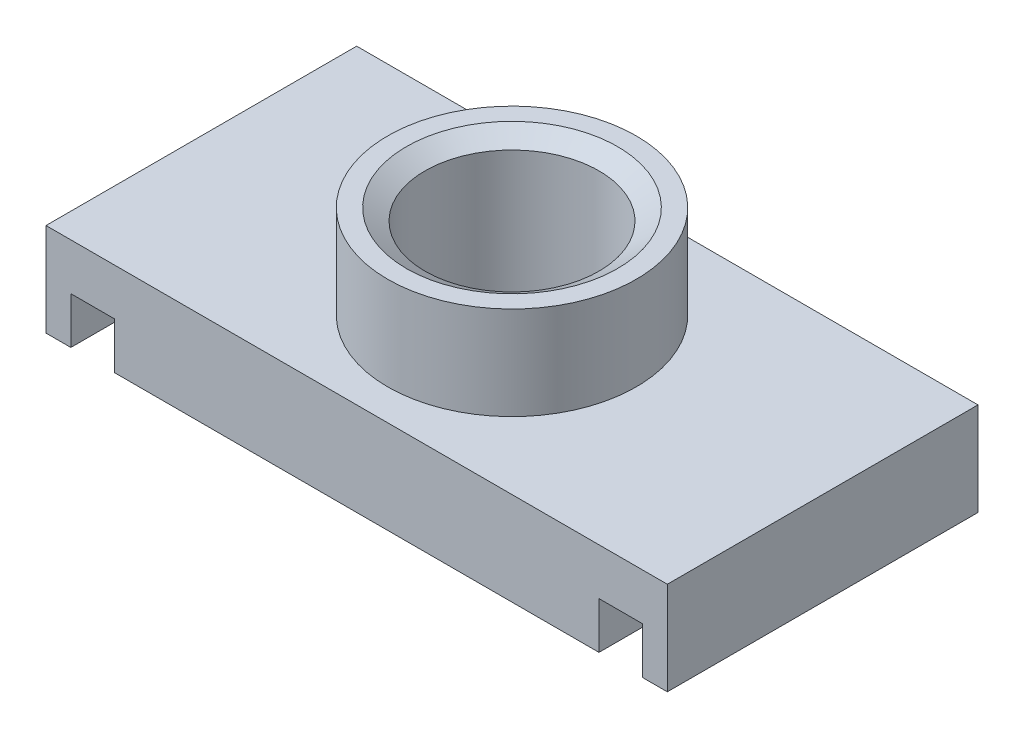
ISO-10303-21;
HEADER;
FILE_DESCRIPTION(('STEP AP214'),'2;1');
FILE_NAME('part.step','',(''),(''),'','','');
FILE_SCHEMA(('AUTOMOTIVE_DESIGN { 1 0 10303 214 1 1 1 1 }'));
ENDSEC;
DATA;
#1=APPLICATION_CONTEXT('core data for automotive mechanical design processes');
#2=APPLICATION_PROTOCOL_DEFINITION('international standard','automotive_design',2000,#1);
#3=PRODUCT_CONTEXT('',#1,'mechanical');
#4=PRODUCT('Part','Part','',(#3));
#5=PRODUCT_RELATED_PRODUCT_CATEGORY('part','',(#4));
#6=PRODUCT_DEFINITION_FORMATION('','',#4);
#7=PRODUCT_DEFINITION_CONTEXT('part definition',#1,'design');
#8=PRODUCT_DEFINITION('design','',#6,#7);
#9=PRODUCT_DEFINITION_SHAPE('','',#8);
#10=(LENGTH_UNIT() NAMED_UNIT(*) SI_UNIT(.MILLI.,.METRE.));
#11=(NAMED_UNIT(*) PLANE_ANGLE_UNIT() SI_UNIT($,.RADIAN.));
#12=(NAMED_UNIT(*) SI_UNIT($,.STERADIAN.) SOLID_ANGLE_UNIT());
#13=UNCERTAINTY_MEASURE_WITH_UNIT(LENGTH_MEASURE(1.E-05),#10,'distance_accuracy_value','');
#14=(GEOMETRIC_REPRESENTATION_CONTEXT(3) GLOBAL_UNCERTAINTY_ASSIGNED_CONTEXT((#13)) GLOBAL_UNIT_ASSIGNED_CONTEXT((#10,
#11,#12)) REPRESENTATION_CONTEXT('',''));
#15=CARTESIAN_POINT('',(0.,0.,0.));
#16=DIRECTION('',(0.,0.,1.));
#17=DIRECTION('',(1.,0.,0.));
#18=AXIS2_PLACEMENT_3D('',#15,#16,#17);
#19=CARTESIAN_POINT('',(0.,0.,0.));
#20=DIRECTION('',(0.,1.,0.));
#21=DIRECTION('',(0.,0.,1.));
#22=AXIS2_PLACEMENT_3D('',#19,#20,#21);
#23=PLANE('',#22);
#24=DIRECTION('',(-1.,0.,0.));
#25=VECTOR('',#24,1.);
#26=CARTESIAN_POINT('',(-50.,0.,-25.));
#27=LINE('',#26,#25);
#28=CARTESIAN_POINT('',(-46.,0.,-25.));
#29=VERTEX_POINT('',#28);
#30=CARTESIAN_POINT('',(-50.,0.,-25.));
#31=VERTEX_POINT('',#30);
#32=EDGE_CURVE('E220',#29,#31,#27,.T.);
#33=ORIENTED_EDGE('',*,*,#32,.F.);
#34=DIRECTION('',(0.,0.,1.));
#35=VECTOR('',#34,1.);
#36=CARTESIAN_POINT('',(-46.,0.,0.));
#37=LINE('',#36,#35);
#38=CARTESIAN_POINT('',(-46.,0.,25.));
#39=VERTEX_POINT('',#38);
#40=EDGE_CURVE('E197',#29,#39,#37,.T.);
#41=ORIENTED_EDGE('',*,*,#40,.T.);
#42=DIRECTION('',(1.,0.,0.));
#43=VECTOR('',#42,1.);
#44=CARTESIAN_POINT('',(-50.,0.,25.));
#45=LINE('',#44,#43);
#46=CARTESIAN_POINT('',(-50.,0.,25.));
#47=VERTEX_POINT('',#46);
#48=EDGE_CURVE('E207',#47,#39,#45,.T.);
#49=ORIENTED_EDGE('',*,*,#48,.F.);
#50=DIRECTION('',(0.,0.,1.));
#51=VECTOR('',#50,1.);
#52=CARTESIAN_POINT('',(-50.,0.,-25.));
#53=LINE('',#52,#51);
#54=EDGE_CURVE('E225',#31,#47,#53,.T.);
#55=ORIENTED_EDGE('',*,*,#54,.F.);
#56=EDGE_LOOP('',(#33,#41,#49,#55));
#57=FACE_BOUND('',#56,.T.);
#58=ADVANCED_FACE('F39',(#57),#23,.F.);
#59=CARTESIAN_POINT('',(0.,0.,0.));
#60=DIRECTION('',(0.,1.,0.));
#61=DIRECTION('',(0.,0.,1.));
#62=AXIS2_PLACEMENT_3D('',#59,#60,#61);
#63=CIRCLE('',#62,14.);
#64=CARTESIAN_POINT('',(0.,0.,14.));
#65=VERTEX_POINT('',#64);
#66=EDGE_CURVE('E257',#65,#65,#63,.T.);
#67=ORIENTED_EDGE('',*,*,#66,.T.);
#68=EDGE_LOOP('',(#67));
#69=FACE_BOUND('',#68,.T.);
#70=CARTESIAN_POINT('',(-39.,0.,25.));
#71=VERTEX_POINT('',#70);
#72=CARTESIAN_POINT('',(39.,0.,25.));
#73=VERTEX_POINT('',#72);
#74=EDGE_CURVE('E232',#71,#73,#45,.T.);
#75=ORIENTED_EDGE('',*,*,#74,.F.);
#76=DIRECTION('',(0.,0.,-1.));
#77=VECTOR('',#76,1.);
#78=CARTESIAN_POINT('',(-39.,0.,0.));
#79=LINE('',#78,#77);
#80=CARTESIAN_POINT('',(-39.,0.,-25.));
#81=VERTEX_POINT('',#80);
#82=EDGE_CURVE('E63',#71,#81,#79,.T.);
#83=ORIENTED_EDGE('',*,*,#82,.T.);
#84=CARTESIAN_POINT('',(39.,0.,-25.));
#85=VERTEX_POINT('',#84);
#86=EDGE_CURVE('E226',#85,#81,#27,.T.);
#87=ORIENTED_EDGE('',*,*,#86,.F.);
#88=DIRECTION('',(0.,0.,1.));
#89=VECTOR('',#88,1.);
#90=CARTESIAN_POINT('',(39.,0.,0.));
#91=LINE('',#90,#89);
#92=EDGE_CURVE('E191',#85,#73,#91,.T.);
#93=ORIENTED_EDGE('',*,*,#92,.T.);
#94=EDGE_LOOP('',(#75,#83,#87,#93));
#95=FACE_BOUND('',#94,.T.);
#96=ADVANCED_FACE('F278',(#69,#95),#23,.F.);
#97=CARTESIAN_POINT('',(0.,30.,0.));
#98=DIRECTION('',(0.,1.,0.));
#99=DIRECTION('',(0.,0.,1.));
#100=AXIS2_PLACEMENT_3D('',#97,#98,#99);
#101=PLANE('',#100);
#102=CARTESIAN_POINT('',(0.,30.,0.));
#103=DIRECTION('',(0.,1.,0.));
#104=DIRECTION('',(0.,0.,1.));
#105=AXIS2_PLACEMENT_3D('',#102,#103,#104);
#106=CIRCLE('',#105,17.);
#107=CARTESIAN_POINT('',(0.,30.,17.));
#108=VERTEX_POINT('',#107);
#109=EDGE_CURVE('E252',#108,#108,#106,.T.);
#110=ORIENTED_EDGE('',*,*,#109,.F.);
#111=EDGE_LOOP('',(#110));
#112=FACE_BOUND('',#111,.T.);
#113=CARTESIAN_POINT('',(0.,30.,0.));
#114=DIRECTION('',(0.,1.,0.));
#115=DIRECTION('',(0.,0.,1.));
#116=AXIS2_PLACEMENT_3D('',#113,#114,#115);
#117=CIRCLE('',#116,20.);
#118=CARTESIAN_POINT('',(0.,30.,20.));
#119=VERTEX_POINT('',#118);
#120=EDGE_CURVE('E261',#119,#119,#117,.T.);
#121=ORIENTED_EDGE('',*,*,#120,.T.);
#122=EDGE_LOOP('',(#121));
#123=FACE_BOUND('',#122,.T.);
#124=ADVANCED_FACE('F305',(#112,#123),#101,.T.);
#125=CARTESIAN_POINT('',(46.,0.,25.));
#126=VERTEX_POINT('',#125);
#127=CARTESIAN_POINT('',(50.,0.,25.));
#128=VERTEX_POINT('',#127);
#129=EDGE_CURVE('E229',#126,#128,#45,.T.);
#130=ORIENTED_EDGE('',*,*,#129,.F.);
#131=DIRECTION('',(0.,0.,-1.));
#132=VECTOR('',#131,1.);
#133=CARTESIAN_POINT('',(46.,0.,0.));
#134=LINE('',#133,#132);
#135=CARTESIAN_POINT('',(46.,0.,-25.));
#136=VERTEX_POINT('',#135);
#137=EDGE_CURVE('E55',#126,#136,#134,.T.);
#138=ORIENTED_EDGE('',*,*,#137,.T.);
#139=CARTESIAN_POINT('',(50.,0.,-25.));
#140=VERTEX_POINT('',#139);
#141=EDGE_CURVE('E221',#140,#136,#27,.T.);
#142=ORIENTED_EDGE('',*,*,#141,.F.);
#143=DIRECTION('',(0.,0.,-1.));
#144=VECTOR('',#143,1.);
#145=CARTESIAN_POINT('',(50.,0.,-25.));
#146=LINE('',#145,#144);
#147=EDGE_CURVE('E201',#128,#140,#146,.T.);
#148=ORIENTED_EDGE('',*,*,#147,.F.);
#149=EDGE_LOOP('',(#130,#138,#142,#148));
#150=FACE_BOUND('',#149,.T.);
#151=ADVANCED_FACE('F274',(#150),#23,.F.);
#152=CARTESIAN_POINT('',(0.,30.,0.));
#153=DIRECTION('',(0.,-1.,0.));
#154=DIRECTION('',(0.,0.,-1.));
#155=AXIS2_PLACEMENT_3D('',#152,#153,#154);
#156=CYLINDRICAL_SURFACE('',#155,20.);
#157=CARTESIAN_POINT('',(0.,15.,0.));
#158=DIRECTION('',(0.,1.,0.));
#159=DIRECTION('',(0.,0.,1.));
#160=AXIS2_PLACEMENT_3D('',#157,#158,#159);
#161=CIRCLE('',#160,20.);
#162=CARTESIAN_POINT('',(0.,15.,20.));
#163=VERTEX_POINT('',#162);
#164=EDGE_CURVE('E248',#163,#163,#161,.T.);
#165=ORIENTED_EDGE('',*,*,#164,.T.);
#166=EDGE_LOOP('',(#165));
#167=FACE_BOUND('',#166,.T.);
#168=ORIENTED_EDGE('',*,*,#120,.F.);
#169=EDGE_LOOP('',(#168));
#170=FACE_BOUND('',#169,.T.);
#171=ADVANCED_FACE('F41',(#167,#170),#156,.T.);
#172=CARTESIAN_POINT('',(0.,30.,0.));
#173=DIRECTION('',(0.,-1.,0.));
#174=DIRECTION('',(0.,0.,-1.));
#175=AXIS2_PLACEMENT_3D('',#172,#173,#174);
#176=CYLINDRICAL_SURFACE('',#175,14.);
#177=CARTESIAN_POINT('',(0.,28.1262456870264,0.));
#178=DIRECTION('',(0.,1.,0.));
#179=DIRECTION('',(0.,0.,1.));
#180=AXIS2_PLACEMENT_3D('',#177,#178,#179);
#181=CIRCLE('',#180,14.);
#182=CARTESIAN_POINT('',(0.,28.1262456870264,14.));
#183=VERTEX_POINT('',#182);
#184=EDGE_CURVE('E256',#183,#183,#181,.F.);
#185=ORIENTED_EDGE('',*,*,#184,.F.);
#186=EDGE_LOOP('',(#185));
#187=FACE_BOUND('',#186,.T.);
#188=ORIENTED_EDGE('',*,*,#66,.F.);
#189=EDGE_LOOP('',(#188));
#190=FACE_BOUND('',#189,.T.);
#191=ADVANCED_FACE('F314',(#187,#190),#176,.F.);
#192=CARTESIAN_POINT('',(0.,30.,0.));
#193=DIRECTION('',(0.,1.,0.));
#194=DIRECTION('',(0.,0.,1.));
#195=AXIS2_PLACEMENT_3D('',#192,#193,#194);
#196=CONICAL_SURFACE('',#195,17.,1.01249565882275);
#197=ORIENTED_EDGE('',*,*,#184,.T.);
#198=EDGE_LOOP('',(#197));
#199=FACE_BOUND('',#198,.T.);
#200=ORIENTED_EDGE('',*,*,#109,.T.);
#201=EDGE_LOOP('',(#200));
#202=FACE_BOUND('',#201,.T.);
#203=ADVANCED_FACE('F324',(#199,#202),#196,.F.);
#204=CARTESIAN_POINT('',(0.,15.,0.));
#205=DIRECTION('',(0.,1.,0.));
#206=DIRECTION('',(0.,0.,1.));
#207=AXIS2_PLACEMENT_3D('',#204,#205,#206);
#208=PLANE('',#207);
#209=DIRECTION('',(0.,0.,-1.));
#210=VECTOR('',#209,1.);
#211=CARTESIAN_POINT('',(50.,15.,-25.));
#212=LINE('',#211,#210);
#213=CARTESIAN_POINT('',(50.,15.,25.));
#214=VERTEX_POINT('',#213);
#215=CARTESIAN_POINT('',(50.,15.,-25.));
#216=VERTEX_POINT('',#215);
#217=EDGE_CURVE('E202',#214,#216,#212,.T.);
#218=ORIENTED_EDGE('',*,*,#217,.T.);
#219=DIRECTION('',(-1.,0.,0.));
#220=VECTOR('',#219,1.);
#221=CARTESIAN_POINT('',(-50.,15.,-25.));
#222=LINE('',#221,#220);
#223=CARTESIAN_POINT('',(-50.,15.,-25.));
#224=VERTEX_POINT('',#223);
#225=EDGE_CURVE('E206',#216,#224,#222,.T.);
#226=ORIENTED_EDGE('',*,*,#225,.T.);
#227=DIRECTION('',(0.,0.,1.));
#228=VECTOR('',#227,1.);
#229=CARTESIAN_POINT('',(-50.,15.,-25.));
#230=LINE('',#229,#228);
#231=CARTESIAN_POINT('',(-50.,15.,25.));
#232=VERTEX_POINT('',#231);
#233=EDGE_CURVE('E210',#224,#232,#230,.T.);
#234=ORIENTED_EDGE('',*,*,#233,.T.);
#235=DIRECTION('',(1.,0.,0.));
#236=VECTOR('',#235,1.);
#237=CARTESIAN_POINT('',(-50.,15.,25.));
#238=LINE('',#237,#236);
#239=EDGE_CURVE('E213',#232,#214,#238,.T.);
#240=ORIENTED_EDGE('',*,*,#239,.T.);
#241=EDGE_LOOP('',(#218,#226,#234,#240));
#242=FACE_BOUND('',#241,.T.);
#243=ORIENTED_EDGE('',*,*,#164,.F.);
#244=EDGE_LOOP('',(#243));
#245=FACE_BOUND('',#244,.T.);
#246=ADVANCED_FACE('F328',(#242,#245),#208,.T.);
#247=CARTESIAN_POINT('',(50.,15.,-25.));
#248=DIRECTION('',(-1.,0.,0.));
#249=DIRECTION('',(0.,0.,1.));
#250=AXIS2_PLACEMENT_3D('',#247,#248,#249);
#251=PLANE('',#250);
#252=ORIENTED_EDGE('',*,*,#147,.T.);
#253=DIRECTION('',(0.,-1.,0.));
#254=VECTOR('',#253,1.);
#255=CARTESIAN_POINT('',(50.,15.,-25.));
#256=LINE('',#255,#254);
#257=EDGE_CURVE('E244',#216,#140,#256,.T.);
#258=ORIENTED_EDGE('',*,*,#257,.F.);
#259=ORIENTED_EDGE('',*,*,#217,.F.);
#260=DIRECTION('',(0.,-1.,0.));
#261=VECTOR('',#260,1.);
#262=CARTESIAN_POINT('',(50.,15.,25.));
#263=LINE('',#262,#261);
#264=EDGE_CURVE('E216',#214,#128,#263,.T.);
#265=ORIENTED_EDGE('',*,*,#264,.T.);
#266=EDGE_LOOP('',(#252,#258,#259,#265));
#267=FACE_BOUND('',#266,.T.);
#268=ADVANCED_FACE('F330',(#267),#251,.F.);
#269=CARTESIAN_POINT('',(-50.,15.,-25.));
#270=DIRECTION('',(0.,0.,1.));
#271=DIRECTION('',(1.,0.,0.));
#272=AXIS2_PLACEMENT_3D('',#269,#270,#271);
#273=PLANE('',#272);
#274=DIRECTION('',(-1.,0.,0.));
#275=VECTOR('',#274,1.);
#276=CARTESIAN_POINT('',(-39.,7.5,-25.));
#277=LINE('',#276,#275);
#278=CARTESIAN_POINT('',(-39.,7.5,-25.));
#279=VERTEX_POINT('',#278);
#280=CARTESIAN_POINT('',(-46.,7.5,-25.));
#281=VERTEX_POINT('',#280);
#282=EDGE_CURVE('E139',#279,#281,#277,.T.);
#283=ORIENTED_EDGE('',*,*,#282,.T.);
#284=DIRECTION('',(0.,-1.,0.));
#285=VECTOR('',#284,1.);
#286=CARTESIAN_POINT('',(-46.,-7.5,-25.));
#287=LINE('',#286,#285);
#288=EDGE_CURVE('E148',#281,#29,#287,.T.);
#289=ORIENTED_EDGE('',*,*,#288,.T.);
#290=ORIENTED_EDGE('',*,*,#32,.T.);
#291=DIRECTION('',(0.,-1.,0.));
#292=VECTOR('',#291,1.);
#293=CARTESIAN_POINT('',(-50.,15.,-25.));
#294=LINE('',#293,#292);
#295=EDGE_CURVE('E240',#224,#31,#294,.T.);
#296=ORIENTED_EDGE('',*,*,#295,.F.);
#297=ORIENTED_EDGE('',*,*,#225,.F.);
#298=ORIENTED_EDGE('',*,*,#257,.T.);
#299=ORIENTED_EDGE('',*,*,#141,.T.);
#300=DIRECTION('',(0.,1.,0.));
#301=VECTOR('',#300,1.);
#302=CARTESIAN_POINT('',(46.,-7.5,-25.));
#303=LINE('',#302,#301);
#304=CARTESIAN_POINT('',(46.,7.5,-25.));
#305=VERTEX_POINT('',#304);
#306=EDGE_CURVE('E171',#136,#305,#303,.T.);
#307=ORIENTED_EDGE('',*,*,#306,.T.);
#308=DIRECTION('',(-1.,0.,0.));
#309=VECTOR('',#308,1.);
#310=CARTESIAN_POINT('',(39.,7.5,-25.));
#311=LINE('',#310,#309);
#312=CARTESIAN_POINT('',(39.,7.5,-25.));
#313=VERTEX_POINT('',#312);
#314=EDGE_CURVE('E175',#305,#313,#311,.T.);
#315=ORIENTED_EDGE('',*,*,#314,.T.);
#316=DIRECTION('',(0.,-1.,0.));
#317=VECTOR('',#316,1.);
#318=CARTESIAN_POINT('',(39.,-7.5,-25.));
#319=LINE('',#318,#317);
#320=EDGE_CURVE('E179',#313,#85,#319,.T.);
#321=ORIENTED_EDGE('',*,*,#320,.T.);
#322=ORIENTED_EDGE('',*,*,#86,.T.);
#323=DIRECTION('',(0.,1.,0.));
#324=VECTOR('',#323,1.);
#325=CARTESIAN_POINT('',(-39.,-7.5,-25.));
#326=LINE('',#325,#324);
#327=EDGE_CURVE('E153',#81,#279,#326,.T.);
#328=ORIENTED_EDGE('',*,*,#327,.T.);
#329=EDGE_LOOP('',(#283,#289,#290,#296,#297,#298,#299,#307,#315,#321,#322,#328));
#330=FACE_BOUND('',#329,.T.);
#331=ADVANCED_FACE('F285',(#330),#273,.F.);
#332=CARTESIAN_POINT('',(-50.,15.,-25.));
#333=DIRECTION('',(1.,0.,0.));
#334=DIRECTION('',(0.,0.,-1.));
#335=AXIS2_PLACEMENT_3D('',#332,#333,#334);
#336=PLANE('',#335);
#337=ORIENTED_EDGE('',*,*,#54,.T.);
#338=DIRECTION('',(0.,-1.,0.));
#339=VECTOR('',#338,1.);
#340=CARTESIAN_POINT('',(-50.,15.,25.));
#341=LINE('',#340,#339);
#342=EDGE_CURVE('E236',#232,#47,#341,.T.);
#343=ORIENTED_EDGE('',*,*,#342,.F.);
#344=ORIENTED_EDGE('',*,*,#233,.F.);
#345=ORIENTED_EDGE('',*,*,#295,.T.);
#346=EDGE_LOOP('',(#337,#343,#344,#345));
#347=FACE_BOUND('',#346,.T.);
#348=ADVANCED_FACE('F336',(#347),#336,.F.);
#349=CARTESIAN_POINT('',(-50.,15.,25.));
#350=DIRECTION('',(0.,0.,-1.));
#351=DIRECTION('',(-1.,0.,0.));
#352=AXIS2_PLACEMENT_3D('',#349,#350,#351);
#353=PLANE('',#352);
#354=ORIENTED_EDGE('',*,*,#48,.T.);
#355=DIRECTION('',(0.,-1.,0.));
#356=VECTOR('',#355,1.);
#357=CARTESIAN_POINT('',(-46.,-7.5,25.));
#358=LINE('',#357,#356);
#359=CARTESIAN_POINT('',(-46.,7.5,25.));
#360=VERTEX_POINT('',#359);
#361=EDGE_CURVE('E146',#360,#39,#358,.T.);
#362=ORIENTED_EDGE('',*,*,#361,.F.);
#363=DIRECTION('',(-1.,0.,0.));
#364=VECTOR('',#363,1.);
#365=CARTESIAN_POINT('',(-39.,7.5,25.));
#366=LINE('',#365,#364);
#367=CARTESIAN_POINT('',(-39.,7.5,25.));
#368=VERTEX_POINT('',#367);
#369=EDGE_CURVE('E136',#368,#360,#366,.T.);
#370=ORIENTED_EDGE('',*,*,#369,.F.);
#371=DIRECTION('',(0.,-1.,0.));
#372=VECTOR('',#371,1.);
#373=CARTESIAN_POINT('',(-39.,15.,25.));
#374=LINE('',#373,#372);
#375=EDGE_CURVE('E11',#368,#71,#374,.T.);
#376=ORIENTED_EDGE('',*,*,#375,.T.);
#377=ORIENTED_EDGE('',*,*,#74,.T.);
#378=DIRECTION('',(0.,-1.,0.));
#379=VECTOR('',#378,1.);
#380=CARTESIAN_POINT('',(39.,-7.5,25.));
#381=LINE('',#380,#379);
#382=CARTESIAN_POINT('',(39.,7.5,25.));
#383=VERTEX_POINT('',#382);
#384=EDGE_CURVE('E168',#383,#73,#381,.T.);
#385=ORIENTED_EDGE('',*,*,#384,.F.);
#386=DIRECTION('',(-1.,0.,0.));
#387=VECTOR('',#386,1.);
#388=CARTESIAN_POINT('',(39.,7.5,25.));
#389=LINE('',#388,#387);
#390=CARTESIAN_POINT('',(46.,7.5,25.));
#391=VERTEX_POINT('',#390);
#392=EDGE_CURVE('E164',#391,#383,#389,.T.);
#393=ORIENTED_EDGE('',*,*,#392,.F.);
#394=DIRECTION('',(0.,-1.,0.));
#395=VECTOR('',#394,1.);
#396=CARTESIAN_POINT('',(46.,15.,25.));
#397=LINE('',#396,#395);
#398=EDGE_CURVE('E48',#391,#126,#397,.T.);
#399=ORIENTED_EDGE('',*,*,#398,.T.);
#400=ORIENTED_EDGE('',*,*,#129,.T.);
#401=ORIENTED_EDGE('',*,*,#264,.F.);
#402=ORIENTED_EDGE('',*,*,#239,.F.);
#403=ORIENTED_EDGE('',*,*,#342,.T.);
#404=EDGE_LOOP('',(#354,#362,#370,#376,#377,#385,#393,#399,#400,#401,#402,#403));
#405=FACE_BOUND('',#404,.T.);
#406=ADVANCED_FACE('F145',(#405),#353,.F.);
#407=CARTESIAN_POINT('',(39.,-7.5,-25.));
#408=DIRECTION('',(-1.,0.,0.));
#409=DIRECTION('',(0.,0.,1.));
#410=AXIS2_PLACEMENT_3D('',#407,#408,#409);
#411=PLANE('',#410);
#412=ORIENTED_EDGE('',*,*,#320,.F.);
#413=DIRECTION('',(0.,0.,1.));
#414=VECTOR('',#413,1.);
#415=CARTESIAN_POINT('',(39.,7.5,-25.));
#416=LINE('',#415,#414);
#417=EDGE_CURVE('E155',#313,#383,#416,.T.);
#418=ORIENTED_EDGE('',*,*,#417,.T.);
#419=ORIENTED_EDGE('',*,*,#384,.T.);
#420=ORIENTED_EDGE('',*,*,#92,.F.);
#421=EDGE_LOOP('',(#412,#418,#419,#420));
#422=FACE_BOUND('',#421,.T.);
#423=ADVANCED_FACE('F283',(#422),#411,.F.);
#424=CARTESIAN_POINT('',(46.,-7.5,-25.));
#425=DIRECTION('',(1.,0.,0.));
#426=DIRECTION('',(0.,0.,-1.));
#427=AXIS2_PLACEMENT_3D('',#424,#425,#426);
#428=PLANE('',#427);
#429=ORIENTED_EDGE('',*,*,#398,.F.);
#430=DIRECTION('',(0.,0.,1.));
#431=VECTOR('',#430,1.);
#432=CARTESIAN_POINT('',(46.,7.5,-25.));
#433=LINE('',#432,#431);
#434=EDGE_CURVE('E183',#305,#391,#433,.T.);
#435=ORIENTED_EDGE('',*,*,#434,.F.);
#436=ORIENTED_EDGE('',*,*,#306,.F.);
#437=ORIENTED_EDGE('',*,*,#137,.F.);
#438=EDGE_LOOP('',(#429,#435,#436,#437));
#439=FACE_BOUND('',#438,.T.);
#440=ADVANCED_FACE('F289',(#439),#428,.F.);
#441=CARTESIAN_POINT('',(39.,7.5,-25.));
#442=DIRECTION('',(0.,1.,0.));
#443=DIRECTION('',(0.,0.,1.));
#444=AXIS2_PLACEMENT_3D('',#441,#442,#443);
#445=PLANE('',#444);
#446=ORIENTED_EDGE('',*,*,#417,.F.);
#447=ORIENTED_EDGE('',*,*,#314,.F.);
#448=ORIENTED_EDGE('',*,*,#434,.T.);
#449=ORIENTED_EDGE('',*,*,#392,.T.);
#450=EDGE_LOOP('',(#446,#447,#448,#449));
#451=FACE_BOUND('',#450,.T.);
#452=ADVANCED_FACE('F288',(#451),#445,.F.);
#453=CARTESIAN_POINT('',(-46.,-7.5,-25.));
#454=DIRECTION('',(-1.,0.,0.));
#455=DIRECTION('',(0.,0.,1.));
#456=AXIS2_PLACEMENT_3D('',#453,#454,#455);
#457=PLANE('',#456);
#458=ORIENTED_EDGE('',*,*,#288,.F.);
#459=DIRECTION('',(0.,0.,1.));
#460=VECTOR('',#459,1.);
#461=CARTESIAN_POINT('',(-46.,7.5,-25.));
#462=LINE('',#461,#460);
#463=EDGE_CURVE('E142',#281,#360,#462,.T.);
#464=ORIENTED_EDGE('',*,*,#463,.T.);
#465=ORIENTED_EDGE('',*,*,#361,.T.);
#466=ORIENTED_EDGE('',*,*,#40,.F.);
#467=EDGE_LOOP('',(#458,#464,#465,#466));
#468=FACE_BOUND('',#467,.T.);
#469=ADVANCED_FACE('F296',(#468),#457,.F.);
#470=CARTESIAN_POINT('',(-39.,-7.5,-25.));
#471=DIRECTION('',(1.,0.,0.));
#472=DIRECTION('',(0.,0.,-1.));
#473=AXIS2_PLACEMENT_3D('',#470,#471,#472);
#474=PLANE('',#473);
#475=ORIENTED_EDGE('',*,*,#375,.F.);
#476=DIRECTION('',(0.,0.,1.));
#477=VECTOR('',#476,1.);
#478=CARTESIAN_POINT('',(-39.,7.5,-25.));
#479=LINE('',#478,#477);
#480=EDGE_CURVE('E127',#279,#368,#479,.T.);
#481=ORIENTED_EDGE('',*,*,#480,.F.);
#482=ORIENTED_EDGE('',*,*,#327,.F.);
#483=ORIENTED_EDGE('',*,*,#82,.F.);
#484=EDGE_LOOP('',(#475,#481,#482,#483));
#485=FACE_BOUND('',#484,.T.);
#486=ADVANCED_FACE('F126',(#485),#474,.F.);
#487=CARTESIAN_POINT('',(-39.,7.5,-25.));
#488=DIRECTION('',(0.,1.,0.));
#489=DIRECTION('',(0.,0.,1.));
#490=AXIS2_PLACEMENT_3D('',#487,#488,#489);
#491=PLANE('',#490);
#492=ORIENTED_EDGE('',*,*,#463,.F.);
#493=ORIENTED_EDGE('',*,*,#282,.F.);
#494=ORIENTED_EDGE('',*,*,#480,.T.);
#495=ORIENTED_EDGE('',*,*,#369,.T.);
#496=EDGE_LOOP('',(#492,#493,#494,#495));
#497=FACE_BOUND('',#496,.T.);
#498=ADVANCED_FACE('F135',(#497),#491,.F.);
#499=CLOSED_SHELL('',(#58,#96,#124,#151,#171,#191,#203,#246,#268,#331,#348,#406,#423,#440,#452,
#469,#486,#498));
#500=MANIFOLD_SOLID_BREP('B2',#499);
#501=ADVANCED_BREP_SHAPE_REPRESENTATION('',(#18,#500),#14);
#502=SHAPE_DEFINITION_REPRESENTATION(#9,#501);
ENDSEC;
END-ISO-10303-21;
